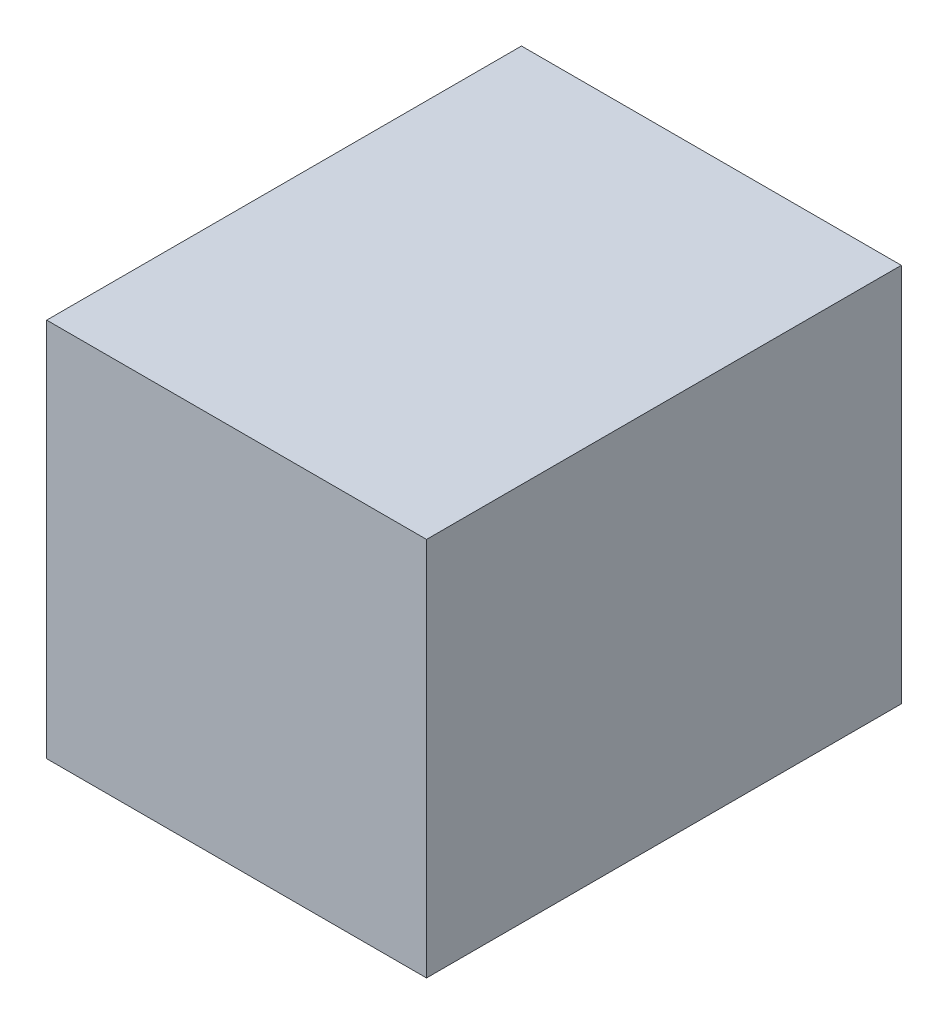
ISO-10303-21;
HEADER;
FILE_DESCRIPTION(('STEP AP214'),'2;1');
FILE_NAME('part.step','',(''),(''),'','','');
FILE_SCHEMA(('AUTOMOTIVE_DESIGN { 1 0 10303 214 1 1 1 1 }'));
ENDSEC;
DATA;
#1=APPLICATION_CONTEXT('core data for automotive mechanical design processes');
#2=APPLICATION_PROTOCOL_DEFINITION('international standard','automotive_design',2000,#1);
#3=PRODUCT_CONTEXT('',#1,'mechanical');
#4=PRODUCT('Part','Part','',(#3));
#5=PRODUCT_RELATED_PRODUCT_CATEGORY('part','',(#4));
#6=PRODUCT_DEFINITION_FORMATION('','',#4);
#7=PRODUCT_DEFINITION_CONTEXT('part definition',#1,'design');
#8=PRODUCT_DEFINITION('design','',#6,#7);
#9=PRODUCT_DEFINITION_SHAPE('','',#8);
#10=(LENGTH_UNIT() NAMED_UNIT(*) SI_UNIT(.MILLI.,.METRE.));
#11=(NAMED_UNIT(*) PLANE_ANGLE_UNIT() SI_UNIT($,.RADIAN.));
#12=(NAMED_UNIT(*) SI_UNIT($,.STERADIAN.) SOLID_ANGLE_UNIT());
#13=UNCERTAINTY_MEASURE_WITH_UNIT(LENGTH_MEASURE(1.E-05),#10,'distance_accuracy_value','');
#14=(GEOMETRIC_REPRESENTATION_CONTEXT(3) GLOBAL_UNCERTAINTY_ASSIGNED_CONTEXT((#13)) GLOBAL_UNIT_ASSIGNED_CONTEXT((#10,
#11,#12)) REPRESENTATION_CONTEXT('',''));
#15=CARTESIAN_POINT('',(0.,0.,0.));
#16=DIRECTION('',(0.,0.,1.));
#17=DIRECTION('',(1.,0.,0.));
#18=AXIS2_PLACEMENT_3D('',#15,#16,#17);
#19=CARTESIAN_POINT('',(10.,20.,-12.5));
#20=DIRECTION('',(-1.,0.,0.));
#21=DIRECTION('',(0.,0.,1.));
#22=AXIS2_PLACEMENT_3D('',#19,#20,#21);
#23=PLANE('',#22);
#24=DIRECTION('',(0.,0.,-1.));
#25=VECTOR('',#24,1.);
#26=CARTESIAN_POINT('',(10.,0.,-12.5));
#27=LINE('',#26,#25);
#28=CARTESIAN_POINT('',(10.,0.,12.5));
#29=VERTEX_POINT('',#28);
#30=CARTESIAN_POINT('',(10.,0.,-12.5));
#31=VERTEX_POINT('',#30);
#32=EDGE_CURVE('E99',#29,#31,#27,.T.);
#33=ORIENTED_EDGE('',*,*,#32,.T.);
#34=DIRECTION('',(0.,-1.,0.));
#35=VECTOR('',#34,1.);
#36=CARTESIAN_POINT('',(10.,20.,-12.5));
#37=LINE('',#36,#35);
#38=CARTESIAN_POINT('',(10.,20.,-12.5));
#39=VERTEX_POINT('',#38);
#40=EDGE_CURVE('E11',#39,#31,#37,.T.);
#41=ORIENTED_EDGE('',*,*,#40,.F.);
#42=DIRECTION('',(0.,0.,-1.));
#43=VECTOR('',#42,1.);
#44=CARTESIAN_POINT('',(10.,20.,-12.5));
#45=LINE('',#44,#43);
#46=CARTESIAN_POINT('',(10.,20.,12.5));
#47=VERTEX_POINT('',#46);
#48=EDGE_CURVE('E87',#47,#39,#45,.T.);
#49=ORIENTED_EDGE('',*,*,#48,.F.);
#50=DIRECTION('',(0.,-1.,0.));
#51=VECTOR('',#50,1.);
#52=CARTESIAN_POINT('',(10.,20.,12.5));
#53=LINE('',#52,#51);
#54=EDGE_CURVE('E95',#47,#29,#53,.T.);
#55=ORIENTED_EDGE('',*,*,#54,.T.);
#56=EDGE_LOOP('',(#33,#41,#49,#55));
#57=FACE_BOUND('',#56,.T.);
#58=ADVANCED_FACE('F36',(#57),#23,.F.);
#59=CARTESIAN_POINT('',(-10.,20.,-12.5));
#60=DIRECTION('',(0.,0.,1.));
#61=DIRECTION('',(1.,0.,0.));
#62=AXIS2_PLACEMENT_3D('',#59,#60,#61);
#63=PLANE('',#62);
#64=DIRECTION('',(-1.,0.,0.));
#65=VECTOR('',#64,1.);
#66=CARTESIAN_POINT('',(-10.,0.,-12.5));
#67=LINE('',#66,#65);
#68=CARTESIAN_POINT('',(-10.,0.,-12.5));
#69=VERTEX_POINT('',#68);
#70=EDGE_CURVE('E91',#31,#69,#67,.T.);
#71=ORIENTED_EDGE('',*,*,#70,.T.);
#72=DIRECTION('',(0.,-1.,0.));
#73=VECTOR('',#72,1.);
#74=CARTESIAN_POINT('',(-10.,20.,-12.5));
#75=LINE('',#74,#73);
#76=CARTESIAN_POINT('',(-10.,20.,-12.5));
#77=VERTEX_POINT('',#76);
#78=EDGE_CURVE('E44',#77,#69,#75,.T.);
#79=ORIENTED_EDGE('',*,*,#78,.F.);
#80=DIRECTION('',(-1.,0.,0.));
#81=VECTOR('',#80,1.);
#82=CARTESIAN_POINT('',(-10.,20.,-12.5));
#83=LINE('',#82,#81);
#84=EDGE_CURVE('E82',#39,#77,#83,.T.);
#85=ORIENTED_EDGE('',*,*,#84,.F.);
#86=ORIENTED_EDGE('',*,*,#40,.T.);
#87=EDGE_LOOP('',(#71,#79,#85,#86));
#88=FACE_BOUND('',#87,.T.);
#89=ADVANCED_FACE('F90',(#88),#63,.F.);
#90=CARTESIAN_POINT('',(-10.,20.,-12.5));
#91=DIRECTION('',(1.,0.,0.));
#92=DIRECTION('',(0.,0.,-1.));
#93=AXIS2_PLACEMENT_3D('',#90,#91,#92);
#94=PLANE('',#93);
#95=DIRECTION('',(0.,0.,1.));
#96=VECTOR('',#95,1.);
#97=CARTESIAN_POINT('',(-10.,0.,-12.5));
#98=LINE('',#97,#96);
#99=CARTESIAN_POINT('',(-9.99999999999999,0.,12.5));
#100=VERTEX_POINT('',#99);
#101=EDGE_CURVE('E69',#69,#100,#98,.T.);
#102=ORIENTED_EDGE('',*,*,#101,.T.);
#103=DIRECTION('',(0.,-1.,0.));
#104=VECTOR('',#103,1.);
#105=CARTESIAN_POINT('',(-9.99999999999999,20.,12.5));
#106=LINE('',#105,#104);
#107=CARTESIAN_POINT('',(-9.99999999999999,20.,12.5));
#108=VERTEX_POINT('',#107);
#109=EDGE_CURVE('E92',#108,#100,#106,.T.);
#110=ORIENTED_EDGE('',*,*,#109,.F.);
#111=DIRECTION('',(0.,0.,1.));
#112=VECTOR('',#111,1.);
#113=CARTESIAN_POINT('',(-10.,20.,-12.5));
#114=LINE('',#113,#112);
#115=EDGE_CURVE('E85',#77,#108,#114,.T.);
#116=ORIENTED_EDGE('',*,*,#115,.F.);
#117=ORIENTED_EDGE('',*,*,#78,.T.);
#118=EDGE_LOOP('',(#102,#110,#116,#117));
#119=FACE_BOUND('',#118,.T.);
#120=ADVANCED_FACE('F93',(#119),#94,.F.);
#121=CARTESIAN_POINT('',(-9.99999999999999,20.,12.5));
#122=DIRECTION('',(0.,0.,-1.));
#123=DIRECTION('',(-1.,0.,0.));
#124=AXIS2_PLACEMENT_3D('',#121,#122,#123);
#125=PLANE('',#124);
#126=DIRECTION('',(1.,0.,0.));
#127=VECTOR('',#126,1.);
#128=CARTESIAN_POINT('',(-9.99999999999999,0.,12.5));
#129=LINE('',#128,#127);
#130=EDGE_CURVE('E75',#100,#29,#129,.T.);
#131=ORIENTED_EDGE('',*,*,#130,.T.);
#132=ORIENTED_EDGE('',*,*,#54,.F.);
#133=DIRECTION('',(1.,0.,0.));
#134=VECTOR('',#133,1.);
#135=CARTESIAN_POINT('',(-9.99999999999999,20.,12.5));
#136=LINE('',#135,#134);
#137=EDGE_CURVE('E52',#108,#47,#136,.T.);
#138=ORIENTED_EDGE('',*,*,#137,.F.);
#139=ORIENTED_EDGE('',*,*,#109,.T.);
#140=EDGE_LOOP('',(#131,#132,#138,#139));
#141=FACE_BOUND('',#140,.T.);
#142=ADVANCED_FACE('F106',(#141),#125,.F.);
#143=CARTESIAN_POINT('',(0.,20.,0.));
#144=DIRECTION('',(0.,1.,0.));
#145=DIRECTION('',(0.,0.,1.));
#146=AXIS2_PLACEMENT_3D('',#143,#144,#145);
#147=PLANE('',#146);
#148=ORIENTED_EDGE('',*,*,#48,.T.);
#149=ORIENTED_EDGE('',*,*,#84,.T.);
#150=ORIENTED_EDGE('',*,*,#115,.T.);
#151=ORIENTED_EDGE('',*,*,#137,.T.);
#152=EDGE_LOOP('',(#148,#149,#150,#151));
#153=FACE_BOUND('',#152,.T.);
#154=ADVANCED_FACE('F83',(#153),#147,.T.);
#155=CARTESIAN_POINT('',(0.,0.,0.));
#156=DIRECTION('',(0.,1.,0.));
#157=DIRECTION('',(0.,0.,1.));
#158=AXIS2_PLACEMENT_3D('',#155,#156,#157);
#159=PLANE('',#158);
#160=ORIENTED_EDGE('',*,*,#32,.F.);
#161=ORIENTED_EDGE('',*,*,#130,.F.);
#162=ORIENTED_EDGE('',*,*,#101,.F.);
#163=ORIENTED_EDGE('',*,*,#70,.F.);
#164=EDGE_LOOP('',(#160,#161,#162,#163));
#165=FACE_BOUND('',#164,.T.);
#166=ADVANCED_FACE('F109',(#165),#159,.F.);
#167=CLOSED_SHELL('',(#58,#89,#120,#142,#154,#166));
#168=MANIFOLD_SOLID_BREP('B2',#167);
#169=ADVANCED_BREP_SHAPE_REPRESENTATION('',(#18,#168),#14);
#170=SHAPE_DEFINITION_REPRESENTATION(#9,#169);
ENDSEC;
END-ISO-10303-21;
